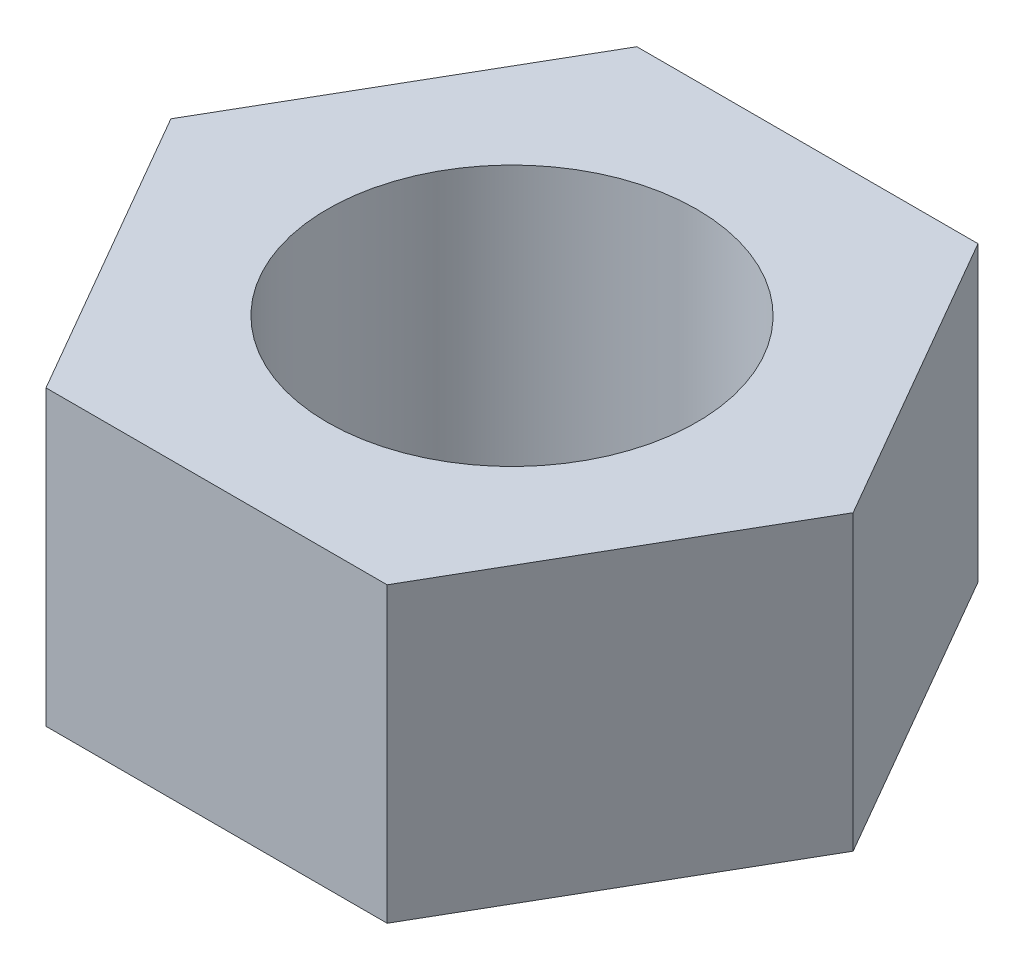
ISO-10303-21;
HEADER;
FILE_DESCRIPTION(('STEP AP214'),'2;1');
FILE_NAME('part.step','',(''),(''),'','','');
FILE_SCHEMA(('AUTOMOTIVE_DESIGN { 1 0 10303 214 1 1 1 1 }'));
ENDSEC;
DATA;
#1=APPLICATION_CONTEXT('core data for automotive mechanical design processes');
#2=APPLICATION_PROTOCOL_DEFINITION('international standard','automotive_design',2000,#1);
#3=PRODUCT_CONTEXT('',#1,'mechanical');
#4=PRODUCT('Part','Part','',(#3));
#5=PRODUCT_RELATED_PRODUCT_CATEGORY('part','',(#4));
#6=PRODUCT_DEFINITION_FORMATION('','',#4);
#7=PRODUCT_DEFINITION_CONTEXT('part definition',#1,'design');
#8=PRODUCT_DEFINITION('design','',#6,#7);
#9=PRODUCT_DEFINITION_SHAPE('','',#8);
#10=(LENGTH_UNIT() NAMED_UNIT(*) SI_UNIT(.MILLI.,.METRE.));
#11=(NAMED_UNIT(*) PLANE_ANGLE_UNIT() SI_UNIT($,.RADIAN.));
#12=(NAMED_UNIT(*) SI_UNIT($,.STERADIAN.) SOLID_ANGLE_UNIT());
#13=UNCERTAINTY_MEASURE_WITH_UNIT(LENGTH_MEASURE(1.E-05),#10,'distance_accuracy_value','');
#14=(GEOMETRIC_REPRESENTATION_CONTEXT(3) GLOBAL_UNCERTAINTY_ASSIGNED_CONTEXT((#13)) GLOBAL_UNIT_ASSIGNED_CONTEXT((#10,
#11,#12)) REPRESENTATION_CONTEXT('',''));
#15=CARTESIAN_POINT('',(0.,0.,0.));
#16=DIRECTION('',(0.,0.,1.));
#17=DIRECTION('',(1.,0.,0.));
#18=AXIS2_PLACEMENT_3D('',#15,#16,#17);
#19=CARTESIAN_POINT('',(0.,6.35,0.));
#20=DIRECTION('',(0.,1.,0.));
#21=DIRECTION('',(0.,0.,1.));
#22=AXIS2_PLACEMENT_3D('',#19,#20,#21);
#23=PLANE('',#22);
#24=DIRECTION('',(0.5,0.,-0.866025403784439));
#25=VECTOR('',#24,1.);
#26=CARTESIAN_POINT('',(3.69504172281361,6.35,6.4));
#27=LINE('',#26,#25);
#28=CARTESIAN_POINT('',(3.69504172281361,6.35,6.4));
#29=VERTEX_POINT('',#28);
#30=CARTESIAN_POINT('',(7.39008344562721,6.35,0.));
#31=VERTEX_POINT('',#30);
#32=EDGE_CURVE('E129',#29,#31,#27,.T.);
#33=ORIENTED_EDGE('',*,*,#32,.T.);
#34=DIRECTION('',(-0.5,0.,-0.866025403784439));
#35=VECTOR('',#34,1.);
#36=CARTESIAN_POINT('',(7.39008344562721,6.35,0.));
#37=LINE('',#36,#35);
#38=CARTESIAN_POINT('',(3.6950417228136,6.35,-6.40000000000001));
#39=VERTEX_POINT('',#38);
#40=EDGE_CURVE('E87',#31,#39,#37,.T.);
#41=ORIENTED_EDGE('',*,*,#40,.T.);
#42=DIRECTION('',(-1.,0.,0.));
#43=VECTOR('',#42,1.);
#44=CARTESIAN_POINT('',(3.6950417228136,6.35,-6.40000000000001));
#45=LINE('',#44,#43);
#46=CARTESIAN_POINT('',(-3.69504172281361,6.35,-6.40000000000001));
#47=VERTEX_POINT('',#46);
#48=EDGE_CURVE('E100',#39,#47,#45,.T.);
#49=ORIENTED_EDGE('',*,*,#48,.T.);
#50=DIRECTION('',(-0.5,0.,0.866025403784439));
#51=VECTOR('',#50,1.);
#52=CARTESIAN_POINT('',(-3.69504172281361,6.35,-6.40000000000001));
#53=LINE('',#52,#51);
#54=CARTESIAN_POINT('',(-7.39008344562721,6.35,0.));
#55=VERTEX_POINT('',#54);
#56=EDGE_CURVE('E94',#47,#55,#53,.T.);
#57=ORIENTED_EDGE('',*,*,#56,.T.);
#58=DIRECTION('',(0.5,0.,0.866025403784439));
#59=VECTOR('',#58,1.);
#60=CARTESIAN_POINT('',(-7.39008344562721,6.35,0.));
#61=LINE('',#60,#59);
#62=CARTESIAN_POINT('',(-3.69504172281361,6.35,6.4));
#63=VERTEX_POINT('',#62);
#64=EDGE_CURVE('E98',#55,#63,#61,.T.);
#65=ORIENTED_EDGE('',*,*,#64,.T.);
#66=DIRECTION('',(1.,0.,0.));
#67=VECTOR('',#66,1.);
#68=CARTESIAN_POINT('',(-3.69504172281361,6.35,6.4));
#69=LINE('',#68,#67);
#70=EDGE_CURVE('E50',#63,#29,#69,.T.);
#71=ORIENTED_EDGE('',*,*,#70,.T.);
#72=EDGE_LOOP('',(#33,#41,#49,#57,#65,#71));
#73=FACE_BOUND('',#72,.T.);
#74=CARTESIAN_POINT('',(0.,6.35,0.));
#75=DIRECTION('',(0.,1.,0.));
#76=DIRECTION('',(0.,0.,1.));
#77=AXIS2_PLACEMENT_3D('',#74,#75,#76);
#78=CIRCLE('',#77,4.);
#79=CARTESIAN_POINT('',(0.,6.35,4.));
#80=VERTEX_POINT('',#79);
#81=EDGE_CURVE('E122',#80,#80,#78,.T.);
#82=ORIENTED_EDGE('',*,*,#81,.F.);
#83=EDGE_LOOP('',(#82));
#84=FACE_BOUND('',#83,.T.);
#85=ADVANCED_FACE('F33',(#73,#84),#23,.T.);
#86=CARTESIAN_POINT('',(0.,0.,0.));
#87=DIRECTION('',(0.,1.,0.));
#88=DIRECTION('',(0.,0.,1.));
#89=AXIS2_PLACEMENT_3D('',#86,#87,#88);
#90=PLANE('',#89);
#91=DIRECTION('',(0.5,0.,-0.866025403784439));
#92=VECTOR('',#91,1.);
#93=CARTESIAN_POINT('',(3.69504172281361,0.,6.4));
#94=LINE('',#93,#92);
#95=CARTESIAN_POINT('',(3.69504172281361,0.,6.4));
#96=VERTEX_POINT('',#95);
#97=CARTESIAN_POINT('',(7.39008344562721,0.,0.));
#98=VERTEX_POINT('',#97);
#99=EDGE_CURVE('E118',#96,#98,#94,.T.);
#100=ORIENTED_EDGE('',*,*,#99,.F.);
#101=DIRECTION('',(1.,0.,0.));
#102=VECTOR('',#101,1.);
#103=CARTESIAN_POINT('',(-3.69504172281361,0.,6.4));
#104=LINE('',#103,#102);
#105=CARTESIAN_POINT('',(-3.69504172281361,0.,6.4));
#106=VERTEX_POINT('',#105);
#107=EDGE_CURVE('E79',#106,#96,#104,.T.);
#108=ORIENTED_EDGE('',*,*,#107,.F.);
#109=DIRECTION('',(0.5,0.,0.866025403784439));
#110=VECTOR('',#109,1.);
#111=CARTESIAN_POINT('',(-7.39008344562721,0.,0.));
#112=LINE('',#111,#110);
#113=CARTESIAN_POINT('',(-7.39008344562721,0.,0.));
#114=VERTEX_POINT('',#113);
#115=EDGE_CURVE('E73',#114,#106,#112,.T.);
#116=ORIENTED_EDGE('',*,*,#115,.F.);
#117=DIRECTION('',(-0.5,0.,0.866025403784439));
#118=VECTOR('',#117,1.);
#119=CARTESIAN_POINT('',(-3.69504172281361,0.,-6.40000000000001));
#120=LINE('',#119,#118);
#121=CARTESIAN_POINT('',(-3.69504172281361,0.,-6.40000000000001));
#122=VERTEX_POINT('',#121);
#123=EDGE_CURVE('E108',#122,#114,#120,.T.);
#124=ORIENTED_EDGE('',*,*,#123,.F.);
#125=DIRECTION('',(-1.,0.,0.));
#126=VECTOR('',#125,1.);
#127=CARTESIAN_POINT('',(3.6950417228136,0.,-6.40000000000001));
#128=LINE('',#127,#126);
#129=CARTESIAN_POINT('',(3.6950417228136,0.,-6.40000000000001));
#130=VERTEX_POINT('',#129);
#131=EDGE_CURVE('E124',#130,#122,#128,.T.);
#132=ORIENTED_EDGE('',*,*,#131,.F.);
#133=DIRECTION('',(-0.5,0.,-0.866025403784439));
#134=VECTOR('',#133,1.);
#135=CARTESIAN_POINT('',(7.39008344562721,0.,0.));
#136=LINE('',#135,#134);
#137=EDGE_CURVE('E121',#98,#130,#136,.T.);
#138=ORIENTED_EDGE('',*,*,#137,.F.);
#139=EDGE_LOOP('',(#100,#108,#116,#124,#132,#138));
#140=FACE_BOUND('',#139,.T.);
#141=CARTESIAN_POINT('',(0.,0.,0.));
#142=DIRECTION('',(0.,1.,0.));
#143=DIRECTION('',(0.,0.,1.));
#144=AXIS2_PLACEMENT_3D('',#141,#142,#143);
#145=CIRCLE('',#144,4.);
#146=CARTESIAN_POINT('',(0.,0.,4.));
#147=VERTEX_POINT('',#146);
#148=EDGE_CURVE('E222',#147,#147,#145,.T.);
#149=ORIENTED_EDGE('',*,*,#148,.T.);
#150=EDGE_LOOP('',(#149));
#151=FACE_BOUND('',#150,.T.);
#152=ADVANCED_FACE('F138',(#140,#151),#90,.F.);
#153=CARTESIAN_POINT('',(3.69504172281361,6.35,6.4));
#154=DIRECTION('',(-0.866025403784439,0.,-0.5));
#155=DIRECTION('',(-0.5,0.,0.866025403784439));
#156=AXIS2_PLACEMENT_3D('',#153,#154,#155);
#157=PLANE('',#156);
#158=ORIENTED_EDGE('',*,*,#99,.T.);
#159=DIRECTION('',(0.,-1.,0.));
#160=VECTOR('',#159,1.);
#161=CARTESIAN_POINT('',(7.39008344562721,6.35,0.));
#162=LINE('',#161,#160);
#163=EDGE_CURVE('E11',#31,#98,#162,.T.);
#164=ORIENTED_EDGE('',*,*,#163,.F.);
#165=ORIENTED_EDGE('',*,*,#32,.F.);
#166=DIRECTION('',(0.,-1.,0.));
#167=VECTOR('',#166,1.);
#168=CARTESIAN_POINT('',(3.69504172281361,6.35,6.4));
#169=LINE('',#168,#167);
#170=EDGE_CURVE('E114',#29,#96,#169,.T.);
#171=ORIENTED_EDGE('',*,*,#170,.T.);
#172=EDGE_LOOP('',(#158,#164,#165,#171));
#173=FACE_BOUND('',#172,.T.);
#174=ADVANCED_FACE('F35',(#173),#157,.F.);
#175=CARTESIAN_POINT('',(7.39008344562721,6.35,0.));
#176=DIRECTION('',(-0.866025403784439,0.,0.5));
#177=DIRECTION('',(0.5,0.,0.866025403784439));
#178=AXIS2_PLACEMENT_3D('',#175,#176,#177);
#179=PLANE('',#178);
#180=ORIENTED_EDGE('',*,*,#137,.T.);
#181=DIRECTION('',(0.,-1.,0.));
#182=VECTOR('',#181,1.);
#183=CARTESIAN_POINT('',(3.6950417228136,6.35,-6.40000000000001));
#184=LINE('',#183,#182);
#185=EDGE_CURVE('E42',#39,#130,#184,.T.);
#186=ORIENTED_EDGE('',*,*,#185,.F.);
#187=ORIENTED_EDGE('',*,*,#40,.F.);
#188=ORIENTED_EDGE('',*,*,#163,.T.);
#189=EDGE_LOOP('',(#180,#186,#187,#188));
#190=FACE_BOUND('',#189,.T.);
#191=ADVANCED_FACE('F163',(#190),#179,.F.);
#192=CARTESIAN_POINT('',(3.6950417228136,6.35,-6.40000000000001));
#193=DIRECTION('',(0.,0.,1.));
#194=DIRECTION('',(1.,0.,0.));
#195=AXIS2_PLACEMENT_3D('',#192,#193,#194);
#196=PLANE('',#195);
#197=ORIENTED_EDGE('',*,*,#131,.T.);
#198=DIRECTION('',(0.,-1.,0.));
#199=VECTOR('',#198,1.);
#200=CARTESIAN_POINT('',(-3.69504172281361,6.35,-6.40000000000001));
#201=LINE('',#200,#199);
#202=EDGE_CURVE('E109',#47,#122,#201,.T.);
#203=ORIENTED_EDGE('',*,*,#202,.F.);
#204=ORIENTED_EDGE('',*,*,#48,.F.);
#205=ORIENTED_EDGE('',*,*,#185,.T.);
#206=EDGE_LOOP('',(#197,#203,#204,#205));
#207=FACE_BOUND('',#206,.T.);
#208=ADVANCED_FACE('F135',(#207),#196,.F.);
#209=CARTESIAN_POINT('',(-3.69504172281361,6.35,-6.40000000000001));
#210=DIRECTION('',(0.866025403784439,0.,0.5));
#211=DIRECTION('',(0.5,0.,-0.866025403784439));
#212=AXIS2_PLACEMENT_3D('',#209,#210,#211);
#213=PLANE('',#212);
#214=ORIENTED_EDGE('',*,*,#123,.T.);
#215=DIRECTION('',(0.,-1.,0.));
#216=VECTOR('',#215,1.);
#217=CARTESIAN_POINT('',(-7.39008344562721,6.35,0.));
#218=LINE('',#217,#216);
#219=EDGE_CURVE('E105',#55,#114,#218,.T.);
#220=ORIENTED_EDGE('',*,*,#219,.F.);
#221=ORIENTED_EDGE('',*,*,#56,.F.);
#222=ORIENTED_EDGE('',*,*,#202,.T.);
#223=EDGE_LOOP('',(#214,#220,#221,#222));
#224=FACE_BOUND('',#223,.T.);
#225=ADVANCED_FACE('F106',(#224),#213,.F.);
#226=CARTESIAN_POINT('',(-7.39008344562721,6.35,0.));
#227=DIRECTION('',(0.866025403784439,0.,-0.5));
#228=DIRECTION('',(-0.5,0.,-0.866025403784439));
#229=AXIS2_PLACEMENT_3D('',#226,#227,#228);
#230=PLANE('',#229);
#231=ORIENTED_EDGE('',*,*,#115,.T.);
#232=DIRECTION('',(0.,-1.,0.));
#233=VECTOR('',#232,1.);
#234=CARTESIAN_POINT('',(-3.69504172281361,6.35,6.4));
#235=LINE('',#234,#233);
#236=EDGE_CURVE('E110',#63,#106,#235,.T.);
#237=ORIENTED_EDGE('',*,*,#236,.F.);
#238=ORIENTED_EDGE('',*,*,#64,.F.);
#239=ORIENTED_EDGE('',*,*,#219,.T.);
#240=EDGE_LOOP('',(#231,#237,#238,#239));
#241=FACE_BOUND('',#240,.T.);
#242=ADVANCED_FACE('F112',(#241),#230,.F.);
#243=CARTESIAN_POINT('',(-3.69504172281361,6.35,6.4));
#244=DIRECTION('',(0.,0.,-1.));
#245=DIRECTION('',(-1.,0.,0.));
#246=AXIS2_PLACEMENT_3D('',#243,#244,#245);
#247=PLANE('',#246);
#248=ORIENTED_EDGE('',*,*,#107,.T.);
#249=ORIENTED_EDGE('',*,*,#170,.F.);
#250=ORIENTED_EDGE('',*,*,#70,.F.);
#251=ORIENTED_EDGE('',*,*,#236,.T.);
#252=EDGE_LOOP('',(#248,#249,#250,#251));
#253=FACE_BOUND('',#252,.T.);
#254=ADVANCED_FACE('F143',(#253),#247,.F.);
#255=CARTESIAN_POINT('',(0.,6.35,0.));
#256=DIRECTION('',(0.,-1.,0.));
#257=DIRECTION('',(0.,0.,-1.));
#258=AXIS2_PLACEMENT_3D('',#255,#256,#257);
#259=CYLINDRICAL_SURFACE('',#258,4.);
#260=ORIENTED_EDGE('',*,*,#81,.T.);
#261=EDGE_LOOP('',(#260));
#262=FACE_BOUND('',#261,.T.);
#263=ORIENTED_EDGE('',*,*,#148,.F.);
#264=EDGE_LOOP('',(#263));
#265=FACE_BOUND('',#264,.T.);
#266=ADVANCED_FACE('F145',(#262,#265),#259,.F.);
#267=CLOSED_SHELL('',(#85,#152,#174,#191,#208,#225,#242,#254,#266));
#268=MANIFOLD_SOLID_BREP('B2',#267);
#269=ADVANCED_BREP_SHAPE_REPRESENTATION('',(#18,#268),#14);
#270=SHAPE_DEFINITION_REPRESENTATION(#9,#269);
ENDSEC;
END-ISO-10303-21;
